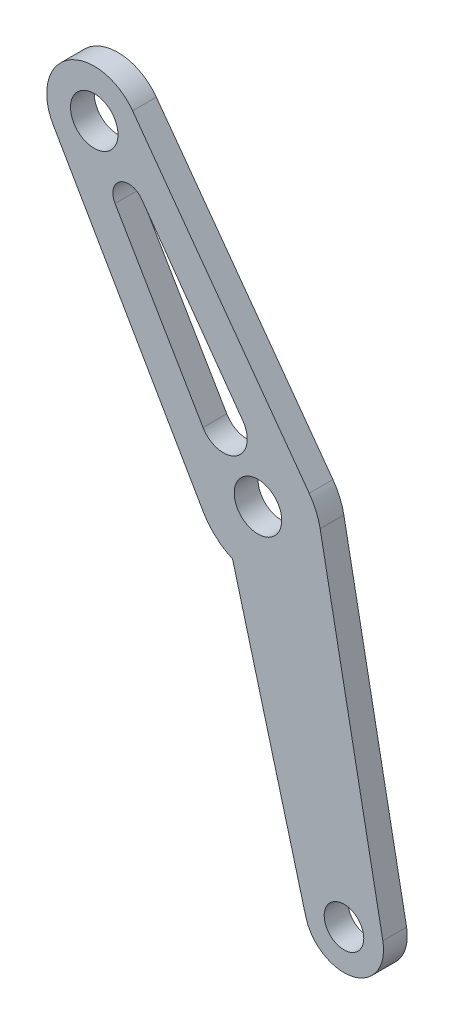
ISO-10303-21;
HEADER;
FILE_DESCRIPTION(('STEP AP214'),'2;1');
FILE_NAME('part.step','',(''),(''),'','','');
FILE_SCHEMA(('AUTOMOTIVE_DESIGN { 1 0 10303 214 1 1 1 1 }'));
ENDSEC;
DATA;
#1=APPLICATION_CONTEXT('core data for automotive mechanical design processes');
#2=APPLICATION_PROTOCOL_DEFINITION('international standard','automotive_design',2000,#1);
#3=PRODUCT_CONTEXT('',#1,'mechanical');
#4=PRODUCT('Part','Part','',(#3));
#5=PRODUCT_RELATED_PRODUCT_CATEGORY('part','',(#4));
#6=PRODUCT_DEFINITION_FORMATION('','',#4);
#7=PRODUCT_DEFINITION_CONTEXT('part definition',#1,'design');
#8=PRODUCT_DEFINITION('design','',#6,#7);
#9=PRODUCT_DEFINITION_SHAPE('','',#8);
#10=(LENGTH_UNIT() NAMED_UNIT(*) SI_UNIT(.MILLI.,.METRE.));
#11=(NAMED_UNIT(*) PLANE_ANGLE_UNIT() SI_UNIT($,.RADIAN.));
#12=(NAMED_UNIT(*) SI_UNIT($,.STERADIAN.) SOLID_ANGLE_UNIT());
#13=UNCERTAINTY_MEASURE_WITH_UNIT(LENGTH_MEASURE(1.E-05),#10,'distance_accuracy_value','');
#14=(GEOMETRIC_REPRESENTATION_CONTEXT(3) GLOBAL_UNCERTAINTY_ASSIGNED_CONTEXT((#13)) GLOBAL_UNIT_ASSIGNED_CONTEXT((#10,
#11,#12)) REPRESENTATION_CONTEXT('',''));
#15=CARTESIAN_POINT('',(0.,0.,0.));
#16=DIRECTION('',(0.,0.,1.));
#17=DIRECTION('',(1.,0.,0.));
#18=AXIS2_PLACEMENT_3D('',#15,#16,#17);
#19=CARTESIAN_POINT('',(-32.750399665372,31.391765860163,3.));
#20=DIRECTION('',(0.,0.,1.));
#21=DIRECTION('',(1.,0.,0.));
#22=AXIS2_PLACEMENT_3D('',#19,#20,#21);
#23=PLANE('',#22);
#24=CARTESIAN_POINT('',(-12.0541163348009,-0.477715721763063,3.));
#25=DIRECTION('',(0.,0.,1.));
#26=DIRECTION('',(1.,0.,0.));
#27=AXIS2_PLACEMENT_3D('',#24,#25,#26);
#28=CIRCLE('',#27,3.);
#29=CARTESIAN_POINT('',(-9.05411633480087,-0.477715721763063,3.));
#30=VERTEX_POINT('',#29);
#31=EDGE_CURVE('E163',#30,#30,#28,.T.);
#32=ORIENTED_EDGE('',*,*,#31,.F.);
#33=EDGE_LOOP('',(#32));
#34=FACE_BOUND('',#33,.T.);
#35=CARTESIAN_POINT('',(-32.750399665372,31.391765860163,3.));
#36=DIRECTION('',(0.,0.,1.));
#37=DIRECTION('',(1.,0.,0.));
#38=AXIS2_PLACEMENT_3D('',#35,#36,#37);
#39=CIRCLE('',#38,6.);
#40=CARTESIAN_POINT('',(-27.8973419266839,34.919914182578,3.));
#41=VERTEX_POINT('',#40);
#42=CARTESIAN_POINT('',(-37.9474399524906,28.3933042122399,3.));
#43=VERTEX_POINT('',#42);
#44=EDGE_CURVE('E175',#41,#43,#39,.T.);
#45=ORIENTED_EDGE('',*,*,#44,.T.);
#46=DIRECTION('',(0.499743607987195,-0.866173381186435,0.));
#47=VECTOR('',#46,1.);
#48=CARTESIAN_POINT('',(-37.9474399524906,28.3933042122399,3.));
#49=LINE('',#48,#47);
#50=CARTESIAN_POINT('',(-18.9835033842924,-4.47566458566063,3.));
#51=VERTEX_POINT('',#50);
#52=EDGE_CURVE('E178',#43,#51,#49,.T.);
#53=ORIENTED_EDGE('',*,*,#52,.T.);
#54=CARTESIAN_POINT('',(-12.0541163348009,-0.477715721763063,3.));
#55=DIRECTION('',(0.,0.,1.));
#56=DIRECTION('',(1.,0.,0.));
#57=AXIS2_PLACEMENT_3D('',#54,#55,#56);
#58=CIRCLE('',#57,8.00000000000001);
#59=CARTESIAN_POINT('',(-15.2674210476336,-7.80401579905222,3.));
#60=VERTEX_POINT('',#59);
#61=EDGE_CURVE('E181',#51,#60,#58,.T.);
#62=ORIENTED_EDGE('',*,*,#61,.T.);
#63=DIRECTION('',(0.258819045102522,-0.965925826289068,0.));
#64=VECTOR('',#63,1.);
#65=CARTESIAN_POINT('',(-15.2674210476336,-7.80401579905222,3.));
#66=LINE('',#65,#64);
#67=CARTESIAN_POINT('',(-6.0133455719403,-42.3406956514165,3.));
#68=VERTEX_POINT('',#67);
#69=EDGE_CURVE('E183',#60,#68,#66,.T.);
#70=ORIENTED_EDGE('',*,*,#69,.T.);
#71=CARTESIAN_POINT('',(-1.18371644049496,-41.0466004259039,3.));
#72=DIRECTION('',(0.,0.,1.));
#73=DIRECTION('',(1.,0.,0.));
#74=AXIS2_PLACEMENT_3D('',#71,#72,#73);
#75=CIRCLE('',#74,5.);
#76=CARTESIAN_POINT('',(3.72601182660465,-40.1007841946819,3.));
#77=VERTEX_POINT('',#76);
#78=EDGE_CURVE('E185',#68,#77,#75,.T.);
#79=ORIENTED_EDGE('',*,*,#78,.T.);
#80=DIRECTION('',(-0.1891632462444,0.981945653419923,0.));
#81=VECTOR('',#80,1.);
#82=CARTESIAN_POINT('',(3.72601182660466,-40.1007841946819,3.));
#83=LINE('',#82,#81);
#84=CARTESIAN_POINT('',(-4.19855110744148,1.03559024819214,3.));
#85=VERTEX_POINT('',#84);
#86=EDGE_CURVE('E187',#77,#85,#83,.T.);
#87=ORIENTED_EDGE('',*,*,#86,.T.);
#88=CARTESIAN_POINT('',(-12.0541163348009,-0.477715721763063,3.));
#89=DIRECTION('',(0.,0.,1.));
#90=DIRECTION('',(1.,0.,0.));
#91=AXIS2_PLACEMENT_3D('',#88,#89,#90);
#92=CIRCLE('',#91,8.);
#93=CARTESIAN_POINT('',(-5.58337268321678,4.22648204145696,3.));
#94=VERTEX_POINT('',#93);
#95=EDGE_CURVE('E189',#85,#94,#92,.T.);
#96=ORIENTED_EDGE('',*,*,#95,.T.);
#97=DIRECTION('',(-0.588024720402503,0.808842956448011,0.));
#98=VECTOR('',#97,1.);
#99=CARTESIAN_POINT('',(-27.8973419266839,34.919914182578,3.));
#100=LINE('',#99,#98);
#101=EDGE_CURVE('E191',#94,#41,#100,.T.);
#102=ORIENTED_EDGE('',*,*,#101,.T.);
#103=EDGE_LOOP('',(#45,#53,#62,#70,#79,#87,#96,#102));
#104=FACE_BOUND('',#103,.T.);
#105=CARTESIAN_POINT('',(-1.18371644049496,-41.0466004259039,3.));
#106=DIRECTION('',(0.,0.,1.));
#107=DIRECTION('',(1.,0.,0.));
#108=AXIS2_PLACEMENT_3D('',#105,#106,#107);
#109=CIRCLE('',#108,2.5);
#110=CARTESIAN_POINT('',(1.31628355950504,-41.0466004259039,3.));
#111=VERTEX_POINT('',#110);
#112=EDGE_CURVE('E169',#111,#111,#109,.T.);
#113=ORIENTED_EDGE('',*,*,#112,.F.);
#114=EDGE_LOOP('',(#113));
#115=FACE_BOUND('',#114,.T.);
#116=CARTESIAN_POINT('',(-32.750399665372,31.391765860163,3.));
#117=DIRECTION('',(0.,0.,1.));
#118=DIRECTION('',(1.,0.,0.));
#119=AXIS2_PLACEMENT_3D('',#116,#117,#118);
#120=CIRCLE('',#119,3.);
#121=CARTESIAN_POINT('',(-29.7503996653719,31.391765860163,3.));
#122=VERTEX_POINT('',#121);
#123=EDGE_CURVE('E157',#122,#122,#120,.T.);
#124=ORIENTED_EDGE('',*,*,#123,.F.);
#125=EDGE_LOOP('',(#124));
#126=FACE_BOUND('',#125,.T.);
#127=DIRECTION('',(0.505954711009421,-0.862560044522915,0.));
#128=VECTOR('',#127,1.);
#129=CARTESIAN_POINT('',(-30.1184074742976,23.6704918945808,3.));
#130=LINE('',#129,#128);
#131=CARTESIAN_POINT('',(-30.1184074742976,23.6704918945808,3.));
#132=VERTEX_POINT('',#131);
#133=CARTESIAN_POINT('',(-18.9989087484899,4.71378468877205,3.));
#134=VERTEX_POINT('',#133);
#135=EDGE_CURVE('E129',#132,#134,#130,.T.);
#136=ORIENTED_EDGE('',*,*,#135,.F.);
#137=CARTESIAN_POINT('',(-28.3932873852517,24.6824013165996,3.));
#138=DIRECTION('',(0.,0.,1.));
#139=DIRECTION('',(1.,0.,0.));
#140=AXIS2_PLACEMENT_3D('',#137,#138,#139);
#141=CIRCLE('',#140,2.);
#142=CARTESIAN_POINT('',(-26.7671925752995,25.8467962964267,3.));
#143=VERTEX_POINT('',#142);
#144=EDGE_CURVE('E121',#143,#132,#141,.T.);
#145=ORIENTED_EDGE('',*,*,#144,.F.);
#146=DIRECTION('',(-0.582197489913552,0.813047404976094,0.));
#147=VECTOR('',#146,1.);
#148=CARTESIAN_POINT('',(-26.7671925752995,25.8467962964267,3.));
#149=LINE('',#148,#147);
#150=CARTESIAN_POINT('',(-13.9720863999928,7.97824129154099,3.));
#151=VERTEX_POINT('',#150);
#152=EDGE_CURVE('E143',#151,#143,#149,.T.);
#153=ORIENTED_EDGE('',*,*,#152,.F.);
#154=CARTESIAN_POINT('',(-16.4112286149211,6.23164882180032,3.));
#155=DIRECTION('',(0.,0.,1.));
#156=DIRECTION('',(1.,0.,0.));
#157=AXIS2_PLACEMENT_3D('',#154,#155,#156);
#158=CIRCLE('',#157,3.00000000000001);
#159=EDGE_CURVE('E141',#134,#151,#158,.T.);
#160=ORIENTED_EDGE('',*,*,#159,.F.);
#161=EDGE_LOOP('',(#136,#145,#153,#160));
#162=FACE_BOUND('',#161,.T.);
#163=ADVANCED_FACE('F32',(#34,#104,#115,#126,#162),#23,.T.);
#164=CARTESIAN_POINT('',(-32.750399665372,31.391765860163,0.));
#165=DIRECTION('',(0.,0.,1.));
#166=DIRECTION('',(1.,0.,0.));
#167=AXIS2_PLACEMENT_3D('',#164,#165,#166);
#168=PLANE('',#167);
#169=CARTESIAN_POINT('',(-32.750399665372,31.391765860163,0.));
#170=DIRECTION('',(0.,0.,1.));
#171=DIRECTION('',(1.,0.,0.));
#172=AXIS2_PLACEMENT_3D('',#169,#170,#171);
#173=CIRCLE('',#172,3.);
#174=CARTESIAN_POINT('',(-29.7503996653719,31.391765860163,0.));
#175=VERTEX_POINT('',#174);
#176=EDGE_CURVE('E137',#175,#175,#173,.T.);
#177=ORIENTED_EDGE('',*,*,#176,.T.);
#178=EDGE_LOOP('',(#177));
#179=FACE_BOUND('',#178,.T.);
#180=CARTESIAN_POINT('',(-12.0541163348009,-0.477715721763063,0.));
#181=DIRECTION('',(0.,0.,1.));
#182=DIRECTION('',(1.,0.,0.));
#183=AXIS2_PLACEMENT_3D('',#180,#181,#182);
#184=CIRCLE('',#183,3.);
#185=CARTESIAN_POINT('',(-9.05411633480087,-0.477715721763063,0.));
#186=VERTEX_POINT('',#185);
#187=EDGE_CURVE('E160',#186,#186,#184,.T.);
#188=ORIENTED_EDGE('',*,*,#187,.T.);
#189=EDGE_LOOP('',(#188));
#190=FACE_BOUND('',#189,.T.);
#191=CARTESIAN_POINT('',(-1.18371644049496,-41.0466004259039,0.));
#192=DIRECTION('',(0.,0.,1.));
#193=DIRECTION('',(1.,0.,0.));
#194=AXIS2_PLACEMENT_3D('',#191,#192,#193);
#195=CIRCLE('',#194,2.5);
#196=CARTESIAN_POINT('',(1.31628355950504,-41.0466004259039,0.));
#197=VERTEX_POINT('',#196);
#198=EDGE_CURVE('E166',#197,#197,#195,.T.);
#199=ORIENTED_EDGE('',*,*,#198,.T.);
#200=EDGE_LOOP('',(#199));
#201=FACE_BOUND('',#200,.T.);
#202=CARTESIAN_POINT('',(-32.750399665372,31.391765860163,0.));
#203=DIRECTION('',(0.,0.,1.));
#204=DIRECTION('',(1.,0.,0.));
#205=AXIS2_PLACEMENT_3D('',#202,#203,#204);
#206=CIRCLE('',#205,6.);
#207=CARTESIAN_POINT('',(-27.8973419266839,34.919914182578,0.));
#208=VERTEX_POINT('',#207);
#209=CARTESIAN_POINT('',(-37.9474399524906,28.3933042122399,0.));
#210=VERTEX_POINT('',#209);
#211=EDGE_CURVE('E172',#208,#210,#206,.T.);
#212=ORIENTED_EDGE('',*,*,#211,.F.);
#213=DIRECTION('',(-0.588024720402503,0.808842956448011,0.));
#214=VECTOR('',#213,1.);
#215=CARTESIAN_POINT('',(-27.8973419266839,34.919914182578,0.));
#216=LINE('',#215,#214);
#217=CARTESIAN_POINT('',(-5.58337268321678,4.22648204145696,0.));
#218=VERTEX_POINT('',#217);
#219=EDGE_CURVE('E179',#218,#208,#216,.T.);
#220=ORIENTED_EDGE('',*,*,#219,.F.);
#221=CARTESIAN_POINT('',(-12.0541163348009,-0.477715721763063,0.));
#222=DIRECTION('',(0.,0.,1.));
#223=DIRECTION('',(1.,0.,0.));
#224=AXIS2_PLACEMENT_3D('',#221,#222,#223);
#225=CIRCLE('',#224,8.);
#226=CARTESIAN_POINT('',(-4.19855110744148,1.03559024819214,0.));
#227=VERTEX_POINT('',#226);
#228=EDGE_CURVE('E206',#227,#218,#225,.T.);
#229=ORIENTED_EDGE('',*,*,#228,.F.);
#230=DIRECTION('',(-0.1891632462444,0.981945653419923,0.));
#231=VECTOR('',#230,1.);
#232=CARTESIAN_POINT('',(3.72601182660466,-40.1007841946819,0.));
#233=LINE('',#232,#231);
#234=CARTESIAN_POINT('',(3.72601182660465,-40.1007841946819,0.));
#235=VERTEX_POINT('',#234);
#236=EDGE_CURVE('E204',#235,#227,#233,.T.);
#237=ORIENTED_EDGE('',*,*,#236,.F.);
#238=CARTESIAN_POINT('',(-1.18371644049496,-41.0466004259039,0.));
#239=DIRECTION('',(0.,0.,1.));
#240=DIRECTION('',(1.,0.,0.));
#241=AXIS2_PLACEMENT_3D('',#238,#239,#240);
#242=CIRCLE('',#241,5.);
#243=CARTESIAN_POINT('',(-6.0133455719403,-42.3406956514165,0.));
#244=VERTEX_POINT('',#243);
#245=EDGE_CURVE('E202',#244,#235,#242,.T.);
#246=ORIENTED_EDGE('',*,*,#245,.F.);
#247=DIRECTION('',(0.258819045102522,-0.965925826289068,0.));
#248=VECTOR('',#247,1.);
#249=CARTESIAN_POINT('',(-15.2674210476336,-7.80401579905222,0.));
#250=LINE('',#249,#248);
#251=CARTESIAN_POINT('',(-15.2674210476336,-7.80401579905222,0.));
#252=VERTEX_POINT('',#251);
#253=EDGE_CURVE('E200',#252,#244,#250,.T.);
#254=ORIENTED_EDGE('',*,*,#253,.F.);
#255=CARTESIAN_POINT('',(-12.0541163348009,-0.477715721763063,0.));
#256=DIRECTION('',(0.,0.,1.));
#257=DIRECTION('',(1.,0.,0.));
#258=AXIS2_PLACEMENT_3D('',#255,#256,#257);
#259=CIRCLE('',#258,8.00000000000001);
#260=CARTESIAN_POINT('',(-18.9835033842924,-4.47566458566063,0.));
#261=VERTEX_POINT('',#260);
#262=EDGE_CURVE('E198',#261,#252,#259,.T.);
#263=ORIENTED_EDGE('',*,*,#262,.F.);
#264=DIRECTION('',(0.499743607987195,-0.866173381186435,0.));
#265=VECTOR('',#264,1.);
#266=CARTESIAN_POINT('',(-37.9474399524906,28.3933042122399,0.));
#267=LINE('',#266,#265);
#268=EDGE_CURVE('E196',#210,#261,#267,.T.);
#269=ORIENTED_EDGE('',*,*,#268,.F.);
#270=EDGE_LOOP('',(#212,#220,#229,#237,#246,#254,#263,#269));
#271=FACE_BOUND('',#270,.T.);
#272=CARTESIAN_POINT('',(-28.3932873852517,24.6824013165996,0.));
#273=DIRECTION('',(0.,0.,1.));
#274=DIRECTION('',(1.,0.,0.));
#275=AXIS2_PLACEMENT_3D('',#272,#273,#274);
#276=CIRCLE('',#275,2.);
#277=CARTESIAN_POINT('',(-26.7671925752995,25.8467962964267,0.));
#278=VERTEX_POINT('',#277);
#279=CARTESIAN_POINT('',(-30.1184074742976,23.6704918945808,0.));
#280=VERTEX_POINT('',#279);
#281=EDGE_CURVE('E55',#278,#280,#276,.T.);
#282=ORIENTED_EDGE('',*,*,#281,.T.);
#283=DIRECTION('',(0.505954711009421,-0.862560044522915,0.));
#284=VECTOR('',#283,1.);
#285=CARTESIAN_POINT('',(-30.1184074742976,23.6704918945808,0.));
#286=LINE('',#285,#284);
#287=CARTESIAN_POINT('',(-18.9989087484899,4.71378468877205,0.));
#288=VERTEX_POINT('',#287);
#289=EDGE_CURVE('E136',#280,#288,#286,.T.);
#290=ORIENTED_EDGE('',*,*,#289,.T.);
#291=CARTESIAN_POINT('',(-16.4112286149211,6.23164882180032,0.));
#292=DIRECTION('',(0.,0.,1.));
#293=DIRECTION('',(1.,0.,0.));
#294=AXIS2_PLACEMENT_3D('',#291,#292,#293);
#295=CIRCLE('',#294,3.00000000000001);
#296=CARTESIAN_POINT('',(-13.9720863999928,7.97824129154099,0.));
#297=VERTEX_POINT('',#296);
#298=EDGE_CURVE('E149',#288,#297,#295,.T.);
#299=ORIENTED_EDGE('',*,*,#298,.T.);
#300=DIRECTION('',(-0.582197489913552,0.813047404976094,0.));
#301=VECTOR('',#300,1.);
#302=CARTESIAN_POINT('',(-26.7671925752995,25.8467962964267,0.));
#303=LINE('',#302,#301);
#304=EDGE_CURVE('E130',#297,#278,#303,.T.);
#305=ORIENTED_EDGE('',*,*,#304,.T.);
#306=EDGE_LOOP('',(#282,#290,#299,#305));
#307=FACE_BOUND('',#306,.T.);
#308=ADVANCED_FACE('F236',(#179,#190,#201,#271,#307),#168,.F.);
#309=CARTESIAN_POINT('',(-32.750399665372,31.391765860163,3.));
#310=DIRECTION('',(0.,0.,-1.));
#311=DIRECTION('',(-1.,0.,0.));
#312=AXIS2_PLACEMENT_3D('',#309,#310,#311);
#313=CYLINDRICAL_SURFACE('',#312,6.);
#314=ORIENTED_EDGE('',*,*,#211,.T.);
#315=DIRECTION('',(0.,0.,-1.));
#316=VECTOR('',#315,1.);
#317=CARTESIAN_POINT('',(-37.9474399524906,28.3933042122399,3.));
#318=LINE('',#317,#316);
#319=EDGE_CURVE('E11',#43,#210,#318,.T.);
#320=ORIENTED_EDGE('',*,*,#319,.F.);
#321=ORIENTED_EDGE('',*,*,#44,.F.);
#322=DIRECTION('',(0.,0.,-1.));
#323=VECTOR('',#322,1.);
#324=CARTESIAN_POINT('',(-27.8973419266839,34.919914182578,3.));
#325=LINE('',#324,#323);
#326=EDGE_CURVE('E193',#41,#208,#325,.T.);
#327=ORIENTED_EDGE('',*,*,#326,.T.);
#328=EDGE_LOOP('',(#314,#320,#321,#327));
#329=FACE_BOUND('',#328,.T.);
#330=ADVANCED_FACE('F34',(#329),#313,.T.);
#331=CARTESIAN_POINT('',(-37.9474399524906,28.3933042122399,3.));
#332=DIRECTION('',(0.866173381186435,0.499743607987195,0.));
#333=DIRECTION('',(-0.499743607987195,0.866173381186435,0.));
#334=AXIS2_PLACEMENT_3D('',#331,#332,#333);
#335=PLANE('',#334);
#336=ORIENTED_EDGE('',*,*,#268,.T.);
#337=DIRECTION('',(0.,0.,-1.));
#338=VECTOR('',#337,1.);
#339=CARTESIAN_POINT('',(-18.9835033842924,-4.47566458566063,3.));
#340=LINE('',#339,#338);
#341=EDGE_CURVE('E40',#51,#261,#340,.T.);
#342=ORIENTED_EDGE('',*,*,#341,.F.);
#343=ORIENTED_EDGE('',*,*,#52,.F.);
#344=ORIENTED_EDGE('',*,*,#319,.T.);
#345=EDGE_LOOP('',(#336,#342,#343,#344));
#346=FACE_BOUND('',#345,.T.);
#347=ADVANCED_FACE('F254',(#346),#335,.F.);
#348=CARTESIAN_POINT('',(-12.0541163348009,-0.477715721763063,3.));
#349=DIRECTION('',(0.,0.,-1.));
#350=DIRECTION('',(-1.,0.,0.));
#351=AXIS2_PLACEMENT_3D('',#348,#349,#350);
#352=CYLINDRICAL_SURFACE('',#351,8.00000000000001);
#353=ORIENTED_EDGE('',*,*,#262,.T.);
#354=DIRECTION('',(0.,0.,-1.));
#355=VECTOR('',#354,1.);
#356=CARTESIAN_POINT('',(-15.2674210476336,-7.80401579905222,3.));
#357=LINE('',#356,#355);
#358=EDGE_CURVE('E223',#60,#252,#357,.T.);
#359=ORIENTED_EDGE('',*,*,#358,.F.);
#360=ORIENTED_EDGE('',*,*,#61,.F.);
#361=ORIENTED_EDGE('',*,*,#341,.T.);
#362=EDGE_LOOP('',(#353,#359,#360,#361));
#363=FACE_BOUND('',#362,.T.);
#364=ADVANCED_FACE('F230',(#363),#352,.T.);
#365=CARTESIAN_POINT('',(-15.2674210476336,-7.80401579905222,3.));
#366=DIRECTION('',(0.965925826289068,0.258819045102522,0.));
#367=DIRECTION('',(-0.258819045102522,0.965925826289068,0.));
#368=AXIS2_PLACEMENT_3D('',#365,#366,#367);
#369=PLANE('',#368);
#370=ORIENTED_EDGE('',*,*,#253,.T.);
#371=DIRECTION('',(0.,0.,-1.));
#372=VECTOR('',#371,1.);
#373=CARTESIAN_POINT('',(-6.0133455719403,-42.3406956514165,3.));
#374=LINE('',#373,#372);
#375=EDGE_CURVE('E220',#68,#244,#374,.T.);
#376=ORIENTED_EDGE('',*,*,#375,.F.);
#377=ORIENTED_EDGE('',*,*,#69,.F.);
#378=ORIENTED_EDGE('',*,*,#358,.T.);
#379=EDGE_LOOP('',(#370,#376,#377,#378));
#380=FACE_BOUND('',#379,.T.);
#381=ADVANCED_FACE('F242',(#380),#369,.F.);
#382=CARTESIAN_POINT('',(-1.18371644049496,-41.0466004259039,3.));
#383=DIRECTION('',(0.,0.,-1.));
#384=DIRECTION('',(-1.,0.,0.));
#385=AXIS2_PLACEMENT_3D('',#382,#383,#384);
#386=CYLINDRICAL_SURFACE('',#385,5.);
#387=ORIENTED_EDGE('',*,*,#245,.T.);
#388=DIRECTION('',(0.,0.,-1.));
#389=VECTOR('',#388,1.);
#390=CARTESIAN_POINT('',(3.72601182660465,-40.1007841946819,3.));
#391=LINE('',#390,#389);
#392=EDGE_CURVE('E217',#77,#235,#391,.T.);
#393=ORIENTED_EDGE('',*,*,#392,.F.);
#394=ORIENTED_EDGE('',*,*,#78,.F.);
#395=ORIENTED_EDGE('',*,*,#375,.T.);
#396=EDGE_LOOP('',(#387,#393,#394,#395));
#397=FACE_BOUND('',#396,.T.);
#398=ADVANCED_FACE('F246',(#397),#386,.T.);
#399=CARTESIAN_POINT('',(3.72601182660466,-40.1007841946819,3.));
#400=DIRECTION('',(-0.981945653419923,-0.1891632462444,0.));
#401=DIRECTION('',(0.1891632462444,-0.981945653419923,0.));
#402=AXIS2_PLACEMENT_3D('',#399,#400,#401);
#403=PLANE('',#402);
#404=ORIENTED_EDGE('',*,*,#236,.T.);
#405=DIRECTION('',(0.,0.,-1.));
#406=VECTOR('',#405,1.);
#407=CARTESIAN_POINT('',(-4.19855110744148,1.03559024819214,3.));
#408=LINE('',#407,#406);
#409=EDGE_CURVE('E214',#85,#227,#408,.T.);
#410=ORIENTED_EDGE('',*,*,#409,.F.);
#411=ORIENTED_EDGE('',*,*,#86,.F.);
#412=ORIENTED_EDGE('',*,*,#392,.T.);
#413=EDGE_LOOP('',(#404,#410,#411,#412));
#414=FACE_BOUND('',#413,.T.);
#415=ADVANCED_FACE('F267',(#414),#403,.F.);
#416=CARTESIAN_POINT('',(-12.0541163348009,-0.477715721763063,3.));
#417=DIRECTION('',(0.,0.,-1.));
#418=DIRECTION('',(-1.,0.,0.));
#419=AXIS2_PLACEMENT_3D('',#416,#417,#418);
#420=CYLINDRICAL_SURFACE('',#419,8.);
#421=ORIENTED_EDGE('',*,*,#228,.T.);
#422=DIRECTION('',(0.,0.,-1.));
#423=VECTOR('',#422,1.);
#424=CARTESIAN_POINT('',(-5.58337268321678,4.22648204145696,3.));
#425=LINE('',#424,#423);
#426=EDGE_CURVE('E211',#94,#218,#425,.T.);
#427=ORIENTED_EDGE('',*,*,#426,.F.);
#428=ORIENTED_EDGE('',*,*,#95,.F.);
#429=ORIENTED_EDGE('',*,*,#409,.T.);
#430=EDGE_LOOP('',(#421,#427,#428,#429));
#431=FACE_BOUND('',#430,.T.);
#432=ADVANCED_FACE('F265',(#431),#420,.T.);
#433=CARTESIAN_POINT('',(-27.8973419266839,34.919914182578,3.));
#434=DIRECTION('',(-0.808842956448011,-0.588024720402503,0.));
#435=DIRECTION('',(0.588024720402503,-0.808842956448011,0.));
#436=AXIS2_PLACEMENT_3D('',#433,#434,#435);
#437=PLANE('',#436);
#438=ORIENTED_EDGE('',*,*,#219,.T.);
#439=ORIENTED_EDGE('',*,*,#326,.F.);
#440=ORIENTED_EDGE('',*,*,#101,.F.);
#441=ORIENTED_EDGE('',*,*,#426,.T.);
#442=EDGE_LOOP('',(#438,#439,#440,#441));
#443=FACE_BOUND('',#442,.T.);
#444=ADVANCED_FACE('F260',(#443),#437,.F.);
#445=CARTESIAN_POINT('',(-1.18371644049496,-41.0466004259039,3.));
#446=DIRECTION('',(0.,0.,-1.));
#447=DIRECTION('',(-1.,0.,0.));
#448=AXIS2_PLACEMENT_3D('',#445,#446,#447);
#449=CYLINDRICAL_SURFACE('',#448,2.5);
#450=ORIENTED_EDGE('',*,*,#112,.T.);
#451=EDGE_LOOP('',(#450));
#452=FACE_BOUND('',#451,.T.);
#453=ORIENTED_EDGE('',*,*,#198,.F.);
#454=EDGE_LOOP('',(#453));
#455=FACE_BOUND('',#454,.T.);
#456=ADVANCED_FACE('F286',(#452,#455),#449,.F.);
#457=CARTESIAN_POINT('',(-12.0541163348009,-0.477715721763063,3.));
#458=DIRECTION('',(0.,0.,-1.));
#459=DIRECTION('',(-1.,0.,0.));
#460=AXIS2_PLACEMENT_3D('',#457,#458,#459);
#461=CYLINDRICAL_SURFACE('',#460,3.);
#462=ORIENTED_EDGE('',*,*,#31,.T.);
#463=EDGE_LOOP('',(#462));
#464=FACE_BOUND('',#463,.T.);
#465=ORIENTED_EDGE('',*,*,#187,.F.);
#466=EDGE_LOOP('',(#465));
#467=FACE_BOUND('',#466,.T.);
#468=ADVANCED_FACE('F293',(#464,#467),#461,.F.);
#469=CARTESIAN_POINT('',(-32.750399665372,31.391765860163,3.));
#470=DIRECTION('',(0.,0.,-1.));
#471=DIRECTION('',(-1.,0.,0.));
#472=AXIS2_PLACEMENT_3D('',#469,#470,#471);
#473=CYLINDRICAL_SURFACE('',#472,3.);
#474=ORIENTED_EDGE('',*,*,#123,.T.);
#475=EDGE_LOOP('',(#474));
#476=FACE_BOUND('',#475,.T.);
#477=ORIENTED_EDGE('',*,*,#176,.F.);
#478=EDGE_LOOP('',(#477));
#479=FACE_BOUND('',#478,.T.);
#480=ADVANCED_FACE('F298',(#476,#479),#473,.F.);
#481=CARTESIAN_POINT('',(-28.3932873852517,24.6824013165996,3.));
#482=DIRECTION('',(0.,0.,-1.));
#483=DIRECTION('',(-1.,0.,0.));
#484=AXIS2_PLACEMENT_3D('',#481,#482,#483);
#485=CYLINDRICAL_SURFACE('',#484,2.);
#486=ORIENTED_EDGE('',*,*,#281,.F.);
#487=DIRECTION('',(0.,0.,-1.));
#488=VECTOR('',#487,1.);
#489=CARTESIAN_POINT('',(-26.7671925752995,25.8467962964267,3.));
#490=LINE('',#489,#488);
#491=EDGE_CURVE('E125',#143,#278,#490,.T.);
#492=ORIENTED_EDGE('',*,*,#491,.F.);
#493=ORIENTED_EDGE('',*,*,#144,.T.);
#494=DIRECTION('',(0.,0.,-1.));
#495=VECTOR('',#494,1.);
#496=CARTESIAN_POINT('',(-30.1184074742976,23.6704918945808,3.));
#497=LINE('',#496,#495);
#498=EDGE_CURVE('E124',#132,#280,#497,.T.);
#499=ORIENTED_EDGE('',*,*,#498,.T.);
#500=EDGE_LOOP('',(#486,#492,#493,#499));
#501=FACE_BOUND('',#500,.T.);
#502=ADVANCED_FACE('F123',(#501),#485,.F.);
#503=CARTESIAN_POINT('',(-30.1184074742976,23.6704918945808,3.));
#504=DIRECTION('',(0.862560044522915,0.505954711009421,0.));
#505=DIRECTION('',(-0.505954711009421,0.862560044522915,0.));
#506=AXIS2_PLACEMENT_3D('',#503,#504,#505);
#507=PLANE('',#506);
#508=ORIENTED_EDGE('',*,*,#289,.F.);
#509=ORIENTED_EDGE('',*,*,#498,.F.);
#510=ORIENTED_EDGE('',*,*,#135,.T.);
#511=DIRECTION('',(0.,0.,-1.));
#512=VECTOR('',#511,1.);
#513=CARTESIAN_POINT('',(-18.9989087484899,4.71378468877205,3.));
#514=LINE('',#513,#512);
#515=EDGE_CURVE('E138',#134,#288,#514,.T.);
#516=ORIENTED_EDGE('',*,*,#515,.T.);
#517=EDGE_LOOP('',(#508,#509,#510,#516));
#518=FACE_BOUND('',#517,.T.);
#519=ADVANCED_FACE('F133',(#518),#507,.T.);
#520=CARTESIAN_POINT('',(-16.4112286149211,6.23164882180032,3.));
#521=DIRECTION('',(0.,0.,-1.));
#522=DIRECTION('',(-1.,0.,0.));
#523=AXIS2_PLACEMENT_3D('',#520,#521,#522);
#524=CYLINDRICAL_SURFACE('',#523,3.00000000000001);
#525=ORIENTED_EDGE('',*,*,#298,.F.);
#526=ORIENTED_EDGE('',*,*,#515,.F.);
#527=ORIENTED_EDGE('',*,*,#159,.T.);
#528=DIRECTION('',(0.,0.,-1.));
#529=VECTOR('',#528,1.);
#530=CARTESIAN_POINT('',(-13.9720863999928,7.97824129154099,3.));
#531=LINE('',#530,#529);
#532=EDGE_CURVE('E47',#151,#297,#531,.T.);
#533=ORIENTED_EDGE('',*,*,#532,.T.);
#534=EDGE_LOOP('',(#525,#526,#527,#533));
#535=FACE_BOUND('',#534,.T.);
#536=ADVANCED_FACE('F321',(#535),#524,.F.);
#537=CARTESIAN_POINT('',(-26.7671925752995,25.8467962964267,3.));
#538=DIRECTION('',(-0.813047404976094,-0.582197489913552,0.));
#539=DIRECTION('',(0.582197489913552,-0.813047404976094,0.));
#540=AXIS2_PLACEMENT_3D('',#537,#538,#539);
#541=PLANE('',#540);
#542=ORIENTED_EDGE('',*,*,#304,.F.);
#543=ORIENTED_EDGE('',*,*,#532,.F.);
#544=ORIENTED_EDGE('',*,*,#152,.T.);
#545=ORIENTED_EDGE('',*,*,#491,.T.);
#546=EDGE_LOOP('',(#542,#543,#544,#545));
#547=FACE_BOUND('',#546,.T.);
#548=ADVANCED_FACE('F324',(#547),#541,.T.);
#549=CLOSED_SHELL('',(#163,#308,#330,#347,#364,#381,#398,#415,#432,#444,#456,#468,#480,#502,
#519,#536,#548));
#550=MANIFOLD_SOLID_BREP('B2',#549);
#551=ADVANCED_BREP_SHAPE_REPRESENTATION('',(#18,#550),#14);
#552=SHAPE_DEFINITION_REPRESENTATION(#9,#551);
ENDSEC;
END-ISO-10303-21;
